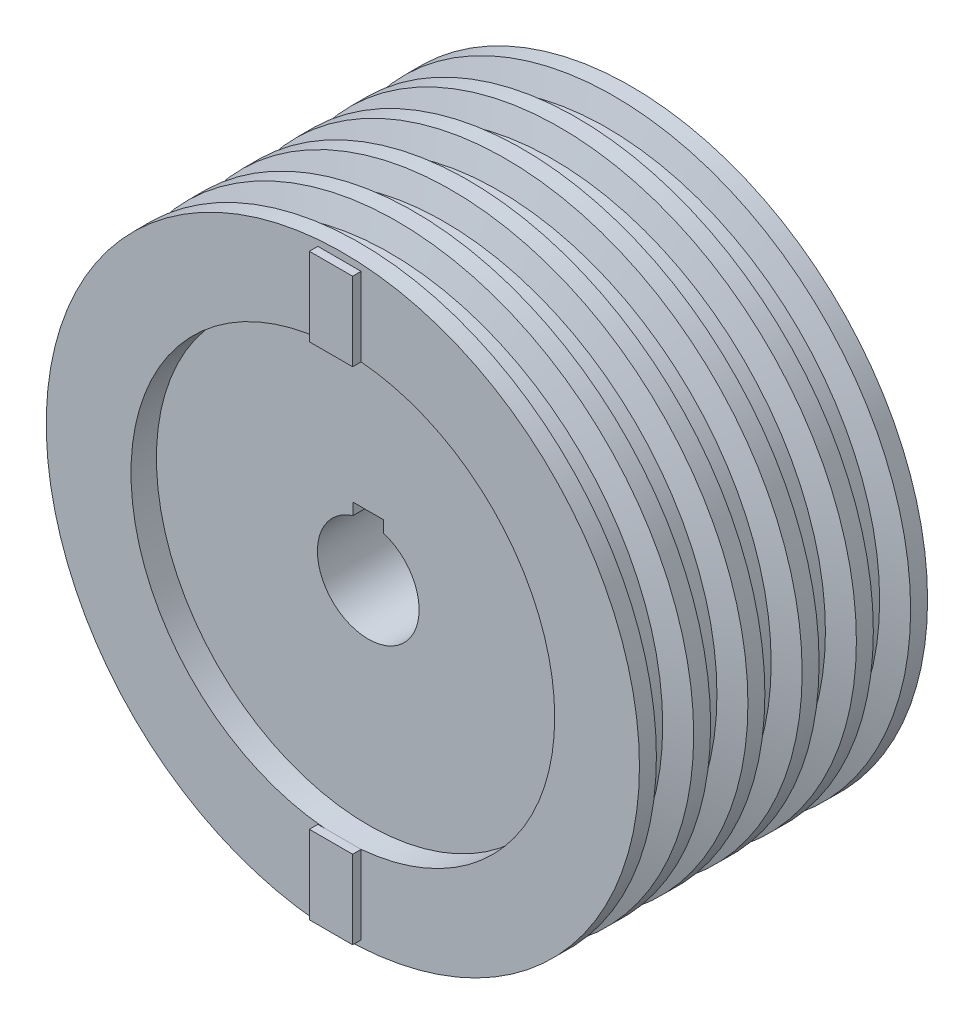
ISO-10303-21;
HEADER;
FILE_DESCRIPTION(('STEP AP214'),'2;1');
FILE_NAME('part.step','',(''),(''),'','','');
FILE_SCHEMA(('AUTOMOTIVE_DESIGN { 1 0 10303 214 1 1 1 1 }'));
ENDSEC;
DATA;
#1=APPLICATION_CONTEXT('core data for automotive mechanical design processes');
#2=APPLICATION_PROTOCOL_DEFINITION('international standard','automotive_design',2000,#1);
#3=PRODUCT_CONTEXT('',#1,'mechanical');
#4=PRODUCT('Part','Part','',(#3));
#5=PRODUCT_RELATED_PRODUCT_CATEGORY('part','',(#4));
#6=PRODUCT_DEFINITION_FORMATION('','',#4);
#7=PRODUCT_DEFINITION_CONTEXT('part definition',#1,'design');
#8=PRODUCT_DEFINITION('design','',#6,#7);
#9=PRODUCT_DEFINITION_SHAPE('','',#8);
#10=(LENGTH_UNIT() NAMED_UNIT(*) SI_UNIT(.MILLI.,.METRE.));
#11=(NAMED_UNIT(*) PLANE_ANGLE_UNIT() SI_UNIT($,.RADIAN.));
#12=(NAMED_UNIT(*) SI_UNIT($,.STERADIAN.) SOLID_ANGLE_UNIT());
#13=UNCERTAINTY_MEASURE_WITH_UNIT(LENGTH_MEASURE(1.E-05),#10,'distance_accuracy_value','');
#14=(GEOMETRIC_REPRESENTATION_CONTEXT(3) GLOBAL_UNCERTAINTY_ASSIGNED_CONTEXT((#13)) GLOBAL_UNIT_ASSIGNED_CONTEXT((#10,
#11,#12)) REPRESENTATION_CONTEXT('',''));
#15=CARTESIAN_POINT('',(0.,0.,0.));
#16=DIRECTION('',(0.,0.,1.));
#17=DIRECTION('',(1.,0.,0.));
#18=AXIS2_PLACEMENT_3D('',#15,#16,#17);
#19=CARTESIAN_POINT('',(0.,0.,85.));
#20=DIRECTION('',(0.,0.,-1.));
#21=DIRECTION('',(-1.,0.,0.));
#22=AXIS2_PLACEMENT_3D('',#19,#20,#21);
#23=CYLINDRICAL_SURFACE('',#22,175.);
#24=CARTESIAN_POINT('',(0.,0.,-75.));
#25=DIRECTION('',(0.,0.,1.));
#26=DIRECTION('',(1.,0.,0.));
#27=AXIS2_PLACEMENT_3D('',#24,#25,#26);
#28=CIRCLE('',#27,175.);
#29=CARTESIAN_POINT('',(175.,0.,-75.));
#30=VERTEX_POINT('',#29);
#31=EDGE_CURVE('E238',#30,#30,#28,.T.);
#32=ORIENTED_EDGE('',*,*,#31,.F.);
#33=EDGE_LOOP('',(#32));
#34=FACE_BOUND('',#33,.T.);
#35=CARTESIAN_POINT('',(0.,0.,-85.));
#36=DIRECTION('',(0.,0.,1.));
#37=DIRECTION('',(1.,0.,0.));
#38=AXIS2_PLACEMENT_3D('',#35,#36,#37);
#39=CIRCLE('',#38,175.);
#40=CARTESIAN_POINT('',(175.,0.,-85.));
#41=VERTEX_POINT('',#40);
#42=EDGE_CURVE('E346',#41,#41,#39,.T.);
#43=ORIENTED_EDGE('',*,*,#42,.T.);
#44=EDGE_LOOP('',(#43));
#45=FACE_BOUND('',#44,.T.);
#46=ADVANCED_FACE('F49',(#34,#45),#23,.T.);
#47=CARTESIAN_POINT('',(0.,0.,-85.));
#48=DIRECTION('',(0.,0.,1.));
#49=DIRECTION('',(1.,0.,0.));
#50=AXIS2_PLACEMENT_3D('',#47,#48,#49);
#51=CYLINDRICAL_SURFACE('',#50,30.);
#52=CARTESIAN_POINT('',(0.,0.,70.));
#53=DIRECTION('',(0.,0.,1.));
#54=DIRECTION('',(1.,0.,0.));
#55=AXIS2_PLACEMENT_3D('',#52,#53,#54);
#56=CIRCLE('',#55,30.);
#57=CARTESIAN_POINT('',(-9.,28.6181760425084,70.));
#58=VERTEX_POINT('',#57);
#59=CARTESIAN_POINT('',(9.,28.6181760425084,70.));
#60=VERTEX_POINT('',#59);
#61=EDGE_CURVE('E334',#58,#60,#56,.T.);
#62=ORIENTED_EDGE('',*,*,#61,.T.);
#63=DIRECTION('',(0.,0.,1.));
#64=VECTOR('',#63,1.);
#65=CARTESIAN_POINT('',(9.,28.6181760425084,-85.));
#66=LINE('',#65,#64);
#67=CARTESIAN_POINT('',(9.,28.6181760425084,-70.));
#68=VERTEX_POINT('',#67);
#69=EDGE_CURVE('E321',#60,#68,#66,.F.);
#70=ORIENTED_EDGE('',*,*,#69,.T.);
#71=CARTESIAN_POINT('',(0.,0.,-70.));
#72=DIRECTION('',(0.,0.,1.));
#73=DIRECTION('',(1.,0.,0.));
#74=AXIS2_PLACEMENT_3D('',#71,#72,#73);
#75=CIRCLE('',#74,30.);
#76=CARTESIAN_POINT('',(-9.,28.6181760425084,-70.));
#77=VERTEX_POINT('',#76);
#78=EDGE_CURVE('E325',#77,#68,#75,.T.);
#79=ORIENTED_EDGE('',*,*,#78,.F.);
#80=DIRECTION('',(0.,0.,1.));
#81=VECTOR('',#80,1.);
#82=CARTESIAN_POINT('',(-9.,28.6181760425084,-85.));
#83=LINE('',#82,#81);
#84=EDGE_CURVE('E314',#77,#58,#83,.T.);
#85=ORIENTED_EDGE('',*,*,#84,.T.);
#86=EDGE_LOOP('',(#62,#70,#79,#85));
#87=FACE_BOUND('',#86,.T.);
#88=ADVANCED_FACE('F375',(#87),#51,.F.);
#89=CARTESIAN_POINT('',(0.,0.,-85.));
#90=DIRECTION('',(0.,0.,1.));
#91=DIRECTION('',(1.,0.,0.));
#92=AXIS2_PLACEMENT_3D('',#89,#90,#91);
#93=PLANE('',#92);
#94=ORIENTED_EDGE('',*,*,#42,.F.);
#95=EDGE_LOOP('',(#94));
#96=FACE_BOUND('',#95,.T.);
#97=CARTESIAN_POINT('',(0.,0.,-85.));
#98=DIRECTION('',(0.,0.,1.));
#99=DIRECTION('',(1.,0.,0.));
#100=AXIS2_PLACEMENT_3D('',#97,#98,#99);
#101=CIRCLE('',#100,125.);
#102=CARTESIAN_POINT('',(125.,0.,-85.));
#103=VERTEX_POINT('',#102);
#104=EDGE_CURVE('E329',#103,#103,#101,.T.);
#105=ORIENTED_EDGE('',*,*,#104,.T.);
#106=EDGE_LOOP('',(#105));
#107=FACE_BOUND('',#106,.T.);
#108=ADVANCED_FACE('F463',(#96,#107),#93,.F.);
#109=CARTESIAN_POINT('',(0.,0.,75.));
#110=DIRECTION('',(0.,0.,1.));
#111=DIRECTION('',(1.,0.,0.));
#112=AXIS2_PLACEMENT_3D('',#109,#110,#111);
#113=CIRCLE('',#112,175.);
#114=CARTESIAN_POINT('',(175.,0.,75.));
#115=VERTEX_POINT('',#114);
#116=EDGE_CURVE('E171',#115,#115,#113,.T.);
#117=ORIENTED_EDGE('',*,*,#116,.T.);
#118=EDGE_LOOP('',(#117));
#119=FACE_BOUND('',#118,.T.);
#120=CARTESIAN_POINT('',(0.,0.,85.));
#121=DIRECTION('',(0.,0.,1.));
#122=DIRECTION('',(1.,0.,0.));
#123=AXIS2_PLACEMENT_3D('',#120,#121,#122);
#124=CIRCLE('',#123,175.);
#125=CARTESIAN_POINT('',(175.,0.,85.));
#126=VERTEX_POINT('',#125);
#127=EDGE_CURVE('E351',#126,#126,#124,.T.);
#128=ORIENTED_EDGE('',*,*,#127,.F.);
#129=EDGE_LOOP('',(#128));
#130=FACE_BOUND('',#129,.T.);
#131=ADVANCED_FACE('F51',(#119,#130),#23,.T.);
#132=CARTESIAN_POINT('',(0.,0.,85.));
#133=DIRECTION('',(0.,0.,1.));
#134=DIRECTION('',(1.,0.,0.));
#135=AXIS2_PLACEMENT_3D('',#132,#133,#134);
#136=PLANE('',#135);
#137=DIRECTION('',(0.,1.,0.));
#138=VECTOR('',#137,1.);
#139=CARTESIAN_POINT('',(10.7653534343434,170.810196385644,85.));
#140=LINE('',#139,#138);
#141=CARTESIAN_POINT('',(10.7653534343434,124.535565865473,85.));
#142=VERTEX_POINT('',#141);
#143=CARTESIAN_POINT('',(10.7653534343434,170.810196385644,85.));
#144=VERTEX_POINT('',#143);
#145=EDGE_CURVE('E413',#142,#144,#140,.T.);
#146=ORIENTED_EDGE('',*,*,#145,.F.);
#147=CARTESIAN_POINT('',(0.,0.,85.));
#148=DIRECTION('',(0.,0.,1.));
#149=DIRECTION('',(1.,0.,0.));
#150=AXIS2_PLACEMENT_3D('',#147,#148,#149);
#151=CIRCLE('',#150,125.);
#152=CARTESIAN_POINT('',(10.7653534343434,-124.535565865473,85.));
#153=VERTEX_POINT('',#152);
#154=EDGE_CURVE('E341',#153,#142,#151,.T.);
#155=ORIENTED_EDGE('',*,*,#154,.F.);
#156=DIRECTION('',(0.,1.,0.));
#157=VECTOR('',#156,1.);
#158=CARTESIAN_POINT('',(10.7653534343434,-170.810196385644,85.));
#159=LINE('',#158,#157);
#160=CARTESIAN_POINT('',(10.7653534343434,-170.810196385644,85.));
#161=VERTEX_POINT('',#160);
#162=EDGE_CURVE('E206',#161,#153,#159,.T.);
#163=ORIENTED_EDGE('',*,*,#162,.F.);
#164=DIRECTION('',(1.,0.,0.));
#165=VECTOR('',#164,1.);
#166=CARTESIAN_POINT('',(-14.7462040045161,-170.810196385644,85.));
#167=LINE('',#166,#165);
#168=CARTESIAN_POINT('',(-14.7462040045161,-170.810196385644,85.));
#169=VERTEX_POINT('',#168);
#170=EDGE_CURVE('E210',#169,#161,#167,.T.);
#171=ORIENTED_EDGE('',*,*,#170,.F.);
#172=DIRECTION('',(0.,-1.,0.));
#173=VECTOR('',#172,1.);
#174=CARTESIAN_POINT('',(-14.7462040045161,-170.810196385644,85.));
#175=LINE('',#174,#173);
#176=CARTESIAN_POINT('',(-14.7462040045161,-124.535565865473,85.));
#177=VERTEX_POINT('',#176);
#178=EDGE_CURVE('E199',#177,#169,#175,.T.);
#179=ORIENTED_EDGE('',*,*,#178,.F.);
#180=DIRECTION('',(-1.,0.,0.));
#181=VECTOR('',#180,1.);
#182=CARTESIAN_POINT('',(-14.7462040045161,-124.535565865473,85.));
#183=LINE('',#182,#181);
#184=CARTESIAN_POINT('',(-10.7653534343434,-124.535565865473,85.));
#185=VERTEX_POINT('',#184);
#186=EDGE_CURVE('E11',#185,#177,#183,.T.);
#187=ORIENTED_EDGE('',*,*,#186,.F.);
#188=CARTESIAN_POINT('',(-10.7653534343434,124.535565865473,85.));
#189=VERTEX_POINT('',#188);
#190=EDGE_CURVE('E350',#189,#185,#151,.T.);
#191=ORIENTED_EDGE('',*,*,#190,.F.);
#192=DIRECTION('',(1.,0.,0.));
#193=VECTOR('',#192,1.);
#194=CARTESIAN_POINT('',(-14.7462040045161,124.535565865473,85.));
#195=LINE('',#194,#193);
#196=CARTESIAN_POINT('',(-14.7462040045161,124.535565865473,85.));
#197=VERTEX_POINT('',#196);
#198=EDGE_CURVE('E405',#197,#189,#195,.T.);
#199=ORIENTED_EDGE('',*,*,#198,.F.);
#200=DIRECTION('',(0.,-1.,0.));
#201=VECTOR('',#200,1.);
#202=CARTESIAN_POINT('',(-14.7462040045161,170.810196385644,85.));
#203=LINE('',#202,#201);
#204=CARTESIAN_POINT('',(-14.7462040045161,170.810196385644,85.));
#205=VERTEX_POINT('',#204);
#206=EDGE_CURVE('E72',#205,#197,#203,.T.);
#207=ORIENTED_EDGE('',*,*,#206,.F.);
#208=DIRECTION('',(-1.,0.,0.));
#209=VECTOR('',#208,1.);
#210=CARTESIAN_POINT('',(-14.7462040045161,170.810196385644,85.));
#211=LINE('',#210,#209);
#212=EDGE_CURVE('E67',#144,#205,#211,.T.);
#213=ORIENTED_EDGE('',*,*,#212,.F.);
#214=EDGE_LOOP('',(#146,#155,#163,#171,#179,#187,#191,#199,#207,#213));
#215=FACE_BOUND('',#214,.T.);
#216=ORIENTED_EDGE('',*,*,#127,.T.);
#217=EDGE_LOOP('',(#216));
#218=FACE_BOUND('',#217,.T.);
#219=ADVANCED_FACE('F394',(#215,#218),#136,.T.);
#220=CARTESIAN_POINT('',(0.,0.,70.));
#221=DIRECTION('',(0.,0.,1.));
#222=DIRECTION('',(1.,0.,0.));
#223=AXIS2_PLACEMENT_3D('',#220,#221,#222);
#224=CYLINDRICAL_SURFACE('',#223,125.);
#225=CARTESIAN_POINT('',(0.,0.,70.));
#226=DIRECTION('',(0.,0.,1.));
#227=DIRECTION('',(1.,0.,0.));
#228=AXIS2_PLACEMENT_3D('',#225,#226,#227);
#229=CIRCLE('',#228,125.);
#230=CARTESIAN_POINT('',(125.,0.,70.));
#231=VERTEX_POINT('',#230);
#232=EDGE_CURVE('E342',#231,#231,#229,.T.);
#233=ORIENTED_EDGE('',*,*,#232,.F.);
#234=EDGE_LOOP('',(#233));
#235=FACE_BOUND('',#234,.T.);
#236=EDGE_CURVE('E347',#142,#189,#151,.T.);
#237=ORIENTED_EDGE('',*,*,#236,.T.);
#238=ORIENTED_EDGE('',*,*,#190,.T.);
#239=EDGE_CURVE('E407',#185,#153,#151,.T.);
#240=ORIENTED_EDGE('',*,*,#239,.T.);
#241=ORIENTED_EDGE('',*,*,#154,.T.);
#242=EDGE_LOOP('',(#237,#238,#240,#241));
#243=FACE_BOUND('',#242,.T.);
#244=ADVANCED_FACE('F388',(#235,#243),#224,.F.);
#245=CARTESIAN_POINT('',(0.,0.,70.));
#246=DIRECTION('',(0.,0.,1.));
#247=DIRECTION('',(1.,0.,0.));
#248=AXIS2_PLACEMENT_3D('',#245,#246,#247);
#249=PLANE('',#248);
#250=DIRECTION('',(0.,1.,0.));
#251=VECTOR('',#250,1.);
#252=CARTESIAN_POINT('',(9.,24.5,70.));
#253=LINE('',#252,#251);
#254=CARTESIAN_POINT('',(9.,35.5,70.));
#255=VERTEX_POINT('',#254);
#256=EDGE_CURVE('E242',#60,#255,#253,.T.);
#257=ORIENTED_EDGE('',*,*,#256,.F.);
#258=ORIENTED_EDGE('',*,*,#61,.F.);
#259=DIRECTION('',(0.,-1.,0.));
#260=VECTOR('',#259,1.);
#261=CARTESIAN_POINT('',(-9.,24.5,70.));
#262=LINE('',#261,#260);
#263=CARTESIAN_POINT('',(-9.,35.5,70.));
#264=VERTEX_POINT('',#263);
#265=EDGE_CURVE('E307',#264,#58,#262,.T.);
#266=ORIENTED_EDGE('',*,*,#265,.F.);
#267=DIRECTION('',(-1.,0.,0.));
#268=VECTOR('',#267,1.);
#269=CARTESIAN_POINT('',(-9.,35.5,70.));
#270=LINE('',#269,#268);
#271=EDGE_CURVE('E303',#255,#264,#270,.T.);
#272=ORIENTED_EDGE('',*,*,#271,.F.);
#273=EDGE_LOOP('',(#257,#258,#266,#272));
#274=FACE_BOUND('',#273,.T.);
#275=ORIENTED_EDGE('',*,*,#232,.T.);
#276=EDGE_LOOP('',(#275));
#277=FACE_BOUND('',#276,.T.);
#278=ADVANCED_FACE('F385',(#274,#277),#249,.T.);
#279=CARTESIAN_POINT('',(0.,0.,-70.));
#280=DIRECTION('',(0.,0.,-1.));
#281=DIRECTION('',(1.,0.,0.));
#282=AXIS2_PLACEMENT_3D('',#279,#280,#281);
#283=PLANE('',#282);
#284=DIRECTION('',(0.,-1.,0.));
#285=VECTOR('',#284,1.);
#286=CARTESIAN_POINT('',(9.,0.,-70.));
#287=LINE('',#286,#285);
#288=CARTESIAN_POINT('',(9.,35.5,-70.));
#289=VERTEX_POINT('',#288);
#290=EDGE_CURVE('E53',#289,#68,#287,.T.);
#291=ORIENTED_EDGE('',*,*,#290,.F.);
#292=DIRECTION('',(1.,0.,0.));
#293=VECTOR('',#292,1.);
#294=CARTESIAN_POINT('',(0.,35.5,-70.));
#295=LINE('',#294,#293);
#296=CARTESIAN_POINT('',(-9.,35.5,-70.));
#297=VERTEX_POINT('',#296);
#298=EDGE_CURVE('E355',#297,#289,#295,.T.);
#299=ORIENTED_EDGE('',*,*,#298,.F.);
#300=DIRECTION('',(0.,1.,0.));
#301=VECTOR('',#300,1.);
#302=CARTESIAN_POINT('',(-9.,0.,-70.));
#303=LINE('',#302,#301);
#304=EDGE_CURVE('E360',#77,#297,#303,.T.);
#305=ORIENTED_EDGE('',*,*,#304,.F.);
#306=ORIENTED_EDGE('',*,*,#78,.T.);
#307=EDGE_LOOP('',(#291,#299,#305,#306));
#308=FACE_BOUND('',#307,.T.);
#309=CARTESIAN_POINT('',(0.,0.,-70.));
#310=DIRECTION('',(0.,0.,1.));
#311=DIRECTION('',(1.,0.,0.));
#312=AXIS2_PLACEMENT_3D('',#309,#310,#311);
#313=CIRCLE('',#312,125.);
#314=CARTESIAN_POINT('',(125.,0.,-70.));
#315=VERTEX_POINT('',#314);
#316=EDGE_CURVE('E330',#315,#315,#313,.T.);
#317=ORIENTED_EDGE('',*,*,#316,.F.);
#318=EDGE_LOOP('',(#317));
#319=FACE_BOUND('',#318,.T.);
#320=ADVANCED_FACE('F377',(#308,#319),#283,.T.);
#321=CARTESIAN_POINT('',(0.,0.,-70.));
#322=DIRECTION('',(0.,0.,-1.));
#323=DIRECTION('',(-1.,0.,0.));
#324=AXIS2_PLACEMENT_3D('',#321,#322,#323);
#325=CYLINDRICAL_SURFACE('',#324,125.);
#326=ORIENTED_EDGE('',*,*,#316,.T.);
#327=EDGE_LOOP('',(#326));
#328=FACE_BOUND('',#327,.T.);
#329=ORIENTED_EDGE('',*,*,#104,.F.);
#330=EDGE_LOOP('',(#329));
#331=FACE_BOUND('',#330,.T.);
#332=ADVANCED_FACE('F564',(#328,#331),#325,.F.);
#333=CARTESIAN_POINT('',(9.,24.5,-85.));
#334=DIRECTION('',(1.,0.,0.));
#335=DIRECTION('',(0.,0.,-1.));
#336=AXIS2_PLACEMENT_3D('',#333,#334,#335);
#337=PLANE('',#336);
#338=ORIENTED_EDGE('',*,*,#256,.T.);
#339=DIRECTION('',(0.,0.,1.));
#340=VECTOR('',#339,1.);
#341=CARTESIAN_POINT('',(9.,35.5,-85.));
#342=LINE('',#341,#340);
#343=EDGE_CURVE('E310',#289,#255,#342,.T.);
#344=ORIENTED_EDGE('',*,*,#343,.F.);
#345=ORIENTED_EDGE('',*,*,#290,.T.);
#346=ORIENTED_EDGE('',*,*,#69,.F.);
#347=EDGE_LOOP('',(#338,#344,#345,#346));
#348=FACE_BOUND('',#347,.T.);
#349=ADVANCED_FACE('F370',(#348),#337,.F.);
#350=CARTESIAN_POINT('',(-9.,24.5,-85.));
#351=DIRECTION('',(-1.,0.,0.));
#352=DIRECTION('',(0.,0.,1.));
#353=AXIS2_PLACEMENT_3D('',#350,#351,#352);
#354=PLANE('',#353);
#355=ORIENTED_EDGE('',*,*,#304,.T.);
#356=DIRECTION('',(0.,0.,1.));
#357=VECTOR('',#356,1.);
#358=CARTESIAN_POINT('',(-9.,35.5,-85.));
#359=LINE('',#358,#357);
#360=EDGE_CURVE('E311',#297,#264,#359,.T.);
#361=ORIENTED_EDGE('',*,*,#360,.T.);
#362=ORIENTED_EDGE('',*,*,#265,.T.);
#363=ORIENTED_EDGE('',*,*,#84,.F.);
#364=EDGE_LOOP('',(#355,#361,#362,#363));
#365=FACE_BOUND('',#364,.T.);
#366=ADVANCED_FACE('F383',(#365),#354,.F.);
#367=CARTESIAN_POINT('',(-9.,35.5,-85.));
#368=DIRECTION('',(0.,1.,0.));
#369=DIRECTION('',(0.,0.,1.));
#370=AXIS2_PLACEMENT_3D('',#367,#368,#369);
#371=PLANE('',#370);
#372=ORIENTED_EDGE('',*,*,#298,.T.);
#373=ORIENTED_EDGE('',*,*,#343,.T.);
#374=ORIENTED_EDGE('',*,*,#271,.T.);
#375=ORIENTED_EDGE('',*,*,#360,.F.);
#376=EDGE_LOOP('',(#372,#373,#374,#375));
#377=FACE_BOUND('',#376,.T.);
#378=ADVANCED_FACE('F380',(#377),#371,.F.);
#379=CARTESIAN_POINT('',(0.,0.,53.));
#380=DIRECTION('',(0.,0.,-1.));
#381=DIRECTION('',(-1.,0.,0.));
#382=AXIS2_PLACEMENT_3D('',#379,#380,#381);
#383=CONICAL_SURFACE('',#382,175.,1.27409035395586);
#384=CARTESIAN_POINT('',(0.,0.,57.2802295404213));
#385=DIRECTION('',(0.,0.,1.));
#386=DIRECTION('',(1.,0.,0.));
#387=AXIS2_PLACEMENT_3D('',#384,#385,#386);
#388=CIRCLE('',#387,161.);
#389=CARTESIAN_POINT('',(161.,0.,57.2802295404213));
#390=VERTEX_POINT('',#389);
#391=EDGE_CURVE('E294',#390,#390,#388,.T.);
#392=ORIENTED_EDGE('',*,*,#391,.F.);
#393=EDGE_LOOP('',(#392));
#394=FACE_BOUND('',#393,.T.);
#395=CARTESIAN_POINT('',(0.,0.,53.));
#396=DIRECTION('',(0.,0.,1.));
#397=DIRECTION('',(1.,0.,0.));
#398=AXIS2_PLACEMENT_3D('',#395,#396,#397);
#399=CIRCLE('',#398,175.);
#400=CARTESIAN_POINT('',(175.,0.,53.));
#401=VERTEX_POINT('',#400);
#402=EDGE_CURVE('E280',#401,#401,#399,.T.);
#403=ORIENTED_EDGE('',*,*,#402,.T.);
#404=EDGE_LOOP('',(#403));
#405=FACE_BOUND('',#404,.T.);
#406=ADVANCED_FACE('F555',(#394,#405),#383,.T.);
#407=CARTESIAN_POINT('',(0.,0.,0.));
#408=DIRECTION('',(0.,0.,1.));
#409=DIRECTION('',(1.,0.,0.));
#410=AXIS2_PLACEMENT_3D('',#407,#408,#409);
#411=CYLINDRICAL_SURFACE('',#410,161.);
#412=CARTESIAN_POINT('',(0.,0.,70.7197704595789));
#413=DIRECTION('',(0.,0.,1.));
#414=DIRECTION('',(1.,0.,0.));
#415=AXIS2_PLACEMENT_3D('',#412,#413,#414);
#416=CIRCLE('',#415,161.);
#417=CARTESIAN_POINT('',(161.,0.,70.7197704595789));
#418=VERTEX_POINT('',#417);
#419=EDGE_CURVE('E176',#418,#418,#416,.T.);
#420=ORIENTED_EDGE('',*,*,#419,.F.);
#421=EDGE_LOOP('',(#420));
#422=FACE_BOUND('',#421,.T.);
#423=ORIENTED_EDGE('',*,*,#391,.T.);
#424=EDGE_LOOP('',(#423));
#425=FACE_BOUND('',#424,.T.);
#426=ADVANCED_FACE('F494',(#422,#425),#411,.T.);
#427=CARTESIAN_POINT('',(0.,0.,70.7197704595789));
#428=DIRECTION('',(0.,0.,1.));
#429=DIRECTION('',(1.,0.,0.));
#430=AXIS2_PLACEMENT_3D('',#427,#428,#429);
#431=CONICAL_SURFACE('',#430,161.,1.27409035395587);
#432=ORIENTED_EDGE('',*,*,#116,.F.);
#433=EDGE_LOOP('',(#432));
#434=FACE_BOUND('',#433,.T.);
#435=ORIENTED_EDGE('',*,*,#419,.T.);
#436=EDGE_LOOP('',(#435));
#437=FACE_BOUND('',#436,.T.);
#438=ADVANCED_FACE('F484',(#434,#437),#431,.T.);
#439=CARTESIAN_POINT('',(0.,0.,43.));
#440=DIRECTION('',(0.,0.,1.));
#441=DIRECTION('',(1.,0.,0.));
#442=AXIS2_PLACEMENT_3D('',#439,#440,#441);
#443=CIRCLE('',#442,175.);
#444=CARTESIAN_POINT('',(175.,0.,43.));
#445=VERTEX_POINT('',#444);
#446=EDGE_CURVE('E284',#445,#445,#443,.T.);
#447=ORIENTED_EDGE('',*,*,#446,.T.);
#448=EDGE_LOOP('',(#447));
#449=FACE_BOUND('',#448,.T.);
#450=ORIENTED_EDGE('',*,*,#402,.F.);
#451=EDGE_LOOP('',(#450));
#452=FACE_BOUND('',#451,.T.);
#453=ADVANCED_FACE('F473',(#449,#452),#23,.T.);
#454=CARTESIAN_POINT('',(0.,0.,21.));
#455=DIRECTION('',(0.,0.,-1.));
#456=DIRECTION('',(-1.,0.,0.));
#457=AXIS2_PLACEMENT_3D('',#454,#455,#456);
#458=CONICAL_SURFACE('',#457,175.,1.27409035395587);
#459=CARTESIAN_POINT('',(0.,0.,25.2802295404211));
#460=DIRECTION('',(0.,0.,1.));
#461=DIRECTION('',(1.,0.,0.));
#462=AXIS2_PLACEMENT_3D('',#459,#460,#461);
#463=CIRCLE('',#462,161.);
#464=CARTESIAN_POINT('',(161.,0.,25.2802295404211));
#465=VERTEX_POINT('',#464);
#466=EDGE_CURVE('E275',#465,#465,#463,.T.);
#467=ORIENTED_EDGE('',*,*,#466,.F.);
#468=EDGE_LOOP('',(#467));
#469=FACE_BOUND('',#468,.T.);
#470=CARTESIAN_POINT('',(0.,0.,21.));
#471=DIRECTION('',(0.,0.,1.));
#472=DIRECTION('',(1.,0.,0.));
#473=AXIS2_PLACEMENT_3D('',#470,#471,#472);
#474=CIRCLE('',#473,175.);
#475=CARTESIAN_POINT('',(175.,0.,21.));
#476=VERTEX_POINT('',#475);
#477=EDGE_CURVE('E264',#476,#476,#474,.T.);
#478=ORIENTED_EDGE('',*,*,#477,.T.);
#479=EDGE_LOOP('',(#478));
#480=FACE_BOUND('',#479,.T.);
#481=ADVANCED_FACE('F483',(#469,#480),#458,.T.);
#482=CARTESIAN_POINT('',(0.,0.,38.7197704595787));
#483=DIRECTION('',(0.,0.,1.));
#484=DIRECTION('',(1.,0.,0.));
#485=AXIS2_PLACEMENT_3D('',#482,#483,#484);
#486=CONICAL_SURFACE('',#485,161.,1.27409035395586);
#487=ORIENTED_EDGE('',*,*,#446,.F.);
#488=EDGE_LOOP('',(#487));
#489=FACE_BOUND('',#488,.T.);
#490=CARTESIAN_POINT('',(0.,0.,38.7197704595787));
#491=DIRECTION('',(0.,0.,1.));
#492=DIRECTION('',(1.,0.,0.));
#493=AXIS2_PLACEMENT_3D('',#490,#491,#492);
#494=CIRCLE('',#493,161.);
#495=CARTESIAN_POINT('',(161.,0.,38.7197704595787));
#496=VERTEX_POINT('',#495);
#497=EDGE_CURVE('E279',#496,#496,#494,.T.);
#498=ORIENTED_EDGE('',*,*,#497,.T.);
#499=EDGE_LOOP('',(#498));
#500=FACE_BOUND('',#499,.T.);
#501=ADVANCED_FACE('F491',(#489,#500),#486,.T.);
#502=CARTESIAN_POINT('',(0.,0.,0.));
#503=DIRECTION('',(0.,0.,1.));
#504=DIRECTION('',(1.,0.,0.));
#505=AXIS2_PLACEMENT_3D('',#502,#503,#504);
#506=CYLINDRICAL_SURFACE('',#505,161.);
#507=ORIENTED_EDGE('',*,*,#497,.F.);
#508=EDGE_LOOP('',(#507));
#509=FACE_BOUND('',#508,.T.);
#510=ORIENTED_EDGE('',*,*,#466,.T.);
#511=EDGE_LOOP('',(#510));
#512=FACE_BOUND('',#511,.T.);
#513=ADVANCED_FACE('F500',(#509,#512),#506,.T.);
#514=CARTESIAN_POINT('',(0.,0.,11.));
#515=DIRECTION('',(0.,0.,1.));
#516=DIRECTION('',(1.,0.,0.));
#517=AXIS2_PLACEMENT_3D('',#514,#515,#516);
#518=CIRCLE('',#517,175.);
#519=CARTESIAN_POINT('',(175.,0.,11.));
#520=VERTEX_POINT('',#519);
#521=EDGE_CURVE('E259',#520,#520,#518,.T.);
#522=ORIENTED_EDGE('',*,*,#521,.T.);
#523=EDGE_LOOP('',(#522));
#524=FACE_BOUND('',#523,.T.);
#525=ORIENTED_EDGE('',*,*,#477,.F.);
#526=EDGE_LOOP('',(#525));
#527=FACE_BOUND('',#526,.T.);
#528=ADVANCED_FACE('F486',(#524,#527),#23,.T.);
#529=CARTESIAN_POINT('',(0.,0.,-11.));
#530=DIRECTION('',(0.,0.,-1.));
#531=DIRECTION('',(-1.,0.,0.));
#532=AXIS2_PLACEMENT_3D('',#529,#530,#531);
#533=CONICAL_SURFACE('',#532,175.,1.27409035395586);
#534=CARTESIAN_POINT('',(0.,0.,-6.7197704595787));
#535=DIRECTION('',(0.,0.,1.));
#536=DIRECTION('',(1.,0.,0.));
#537=AXIS2_PLACEMENT_3D('',#534,#535,#536);
#538=CIRCLE('',#537,161.);
#539=CARTESIAN_POINT('',(161.,0.,-6.7197704595787));
#540=VERTEX_POINT('',#539);
#541=EDGE_CURVE('E268',#540,#540,#538,.T.);
#542=ORIENTED_EDGE('',*,*,#541,.F.);
#543=EDGE_LOOP('',(#542));
#544=FACE_BOUND('',#543,.T.);
#545=CARTESIAN_POINT('',(0.,0.,-11.));
#546=DIRECTION('',(0.,0.,1.));
#547=DIRECTION('',(1.,0.,0.));
#548=AXIS2_PLACEMENT_3D('',#545,#546,#547);
#549=CIRCLE('',#548,175.);
#550=CARTESIAN_POINT('',(175.,0.,-11.));
#551=VERTEX_POINT('',#550);
#552=EDGE_CURVE('E248',#551,#551,#549,.T.);
#553=ORIENTED_EDGE('',*,*,#552,.T.);
#554=EDGE_LOOP('',(#553));
#555=FACE_BOUND('',#554,.T.);
#556=ADVANCED_FACE('F499',(#544,#555),#533,.T.);
#557=CARTESIAN_POINT('',(0.,0.,0.));
#558=DIRECTION('',(0.,0.,1.));
#559=DIRECTION('',(1.,0.,0.));
#560=AXIS2_PLACEMENT_3D('',#557,#558,#559);
#561=CYLINDRICAL_SURFACE('',#560,161.);
#562=CARTESIAN_POINT('',(0.,0.,6.71977045957892));
#563=DIRECTION('',(0.,0.,1.));
#564=DIRECTION('',(1.,0.,0.));
#565=AXIS2_PLACEMENT_3D('',#562,#563,#564);
#566=CIRCLE('',#565,161.);
#567=CARTESIAN_POINT('',(161.,0.,6.71977045957892));
#568=VERTEX_POINT('',#567);
#569=EDGE_CURVE('E263',#568,#568,#566,.T.);
#570=ORIENTED_EDGE('',*,*,#569,.F.);
#571=EDGE_LOOP('',(#570));
#572=FACE_BOUND('',#571,.T.);
#573=ORIENTED_EDGE('',*,*,#541,.T.);
#574=EDGE_LOOP('',(#573));
#575=FACE_BOUND('',#574,.T.);
#576=ADVANCED_FACE('F506',(#572,#575),#561,.T.);
#577=CARTESIAN_POINT('',(0.,0.,6.71977045957892));
#578=DIRECTION('',(0.,0.,1.));
#579=DIRECTION('',(1.,0.,0.));
#580=AXIS2_PLACEMENT_3D('',#577,#578,#579);
#581=CONICAL_SURFACE('',#580,161.,1.27409035395587);
#582=ORIENTED_EDGE('',*,*,#521,.F.);
#583=EDGE_LOOP('',(#582));
#584=FACE_BOUND('',#583,.T.);
#585=ORIENTED_EDGE('',*,*,#569,.T.);
#586=EDGE_LOOP('',(#585));
#587=FACE_BOUND('',#586,.T.);
#588=ADVANCED_FACE('F514',(#584,#587),#581,.T.);
#589=CARTESIAN_POINT('',(0.,0.,-21.));
#590=DIRECTION('',(0.,0.,1.));
#591=DIRECTION('',(1.,0.,0.));
#592=AXIS2_PLACEMENT_3D('',#589,#590,#591);
#593=CIRCLE('',#592,175.);
#594=CARTESIAN_POINT('',(175.,0.,-21.));
#595=VERTEX_POINT('',#594);
#596=EDGE_CURVE('E252',#595,#595,#593,.T.);
#597=ORIENTED_EDGE('',*,*,#596,.T.);
#598=EDGE_LOOP('',(#597));
#599=FACE_BOUND('',#598,.T.);
#600=ORIENTED_EDGE('',*,*,#552,.F.);
#601=EDGE_LOOP('',(#600));
#602=FACE_BOUND('',#601,.T.);
#603=ADVANCED_FACE('F471',(#599,#602),#23,.T.);
#604=CARTESIAN_POINT('',(0.,0.,-43.));
#605=DIRECTION('',(0.,0.,-1.));
#606=DIRECTION('',(-1.,0.,0.));
#607=AXIS2_PLACEMENT_3D('',#604,#605,#606);
#608=CONICAL_SURFACE('',#607,175.,1.27409035395587);
#609=CARTESIAN_POINT('',(0.,0.,-38.719770459579));
#610=DIRECTION('',(0.,0.,1.));
#611=DIRECTION('',(1.,0.,0.));
#612=AXIS2_PLACEMENT_3D('',#609,#610,#611);
#613=CIRCLE('',#612,161.);
#614=CARTESIAN_POINT('',(161.,0.,-38.719770459579));
#615=VERTEX_POINT('',#614);
#616=EDGE_CURVE('E243',#615,#615,#613,.T.);
#617=ORIENTED_EDGE('',*,*,#616,.F.);
#618=EDGE_LOOP('',(#617));
#619=FACE_BOUND('',#618,.T.);
#620=CARTESIAN_POINT('',(0.,0.,-43.));
#621=DIRECTION('',(0.,0.,1.));
#622=DIRECTION('',(1.,0.,0.));
#623=AXIS2_PLACEMENT_3D('',#620,#621,#622);
#624=CIRCLE('',#623,175.);
#625=CARTESIAN_POINT('',(175.,0.,-43.));
#626=VERTEX_POINT('',#625);
#627=EDGE_CURVE('E230',#626,#626,#624,.T.);
#628=ORIENTED_EDGE('',*,*,#627,.T.);
#629=EDGE_LOOP('',(#628));
#630=FACE_BOUND('',#629,.T.);
#631=ADVANCED_FACE('F513',(#619,#630),#608,.T.);
#632=CARTESIAN_POINT('',(0.,0.,-25.2802295404213));
#633=DIRECTION('',(0.,0.,1.));
#634=DIRECTION('',(1.,0.,0.));
#635=AXIS2_PLACEMENT_3D('',#632,#633,#634);
#636=CONICAL_SURFACE('',#635,161.,1.27409035395586);
#637=ORIENTED_EDGE('',*,*,#596,.F.);
#638=EDGE_LOOP('',(#637));
#639=FACE_BOUND('',#638,.T.);
#640=CARTESIAN_POINT('',(0.,0.,-25.2802295404213));
#641=DIRECTION('',(0.,0.,1.));
#642=DIRECTION('',(1.,0.,0.));
#643=AXIS2_PLACEMENT_3D('',#640,#641,#642);
#644=CIRCLE('',#643,161.);
#645=CARTESIAN_POINT('',(161.,0.,-25.2802295404213));
#646=VERTEX_POINT('',#645);
#647=EDGE_CURVE('E247',#646,#646,#644,.T.);
#648=ORIENTED_EDGE('',*,*,#647,.T.);
#649=EDGE_LOOP('',(#648));
#650=FACE_BOUND('',#649,.T.);
#651=ADVANCED_FACE('F520',(#639,#650),#636,.T.);
#652=CARTESIAN_POINT('',(0.,0.,0.));
#653=DIRECTION('',(0.,0.,1.));
#654=DIRECTION('',(1.,0.,0.));
#655=AXIS2_PLACEMENT_3D('',#652,#653,#654);
#656=CYLINDRICAL_SURFACE('',#655,161.);
#657=ORIENTED_EDGE('',*,*,#647,.F.);
#658=EDGE_LOOP('',(#657));
#659=FACE_BOUND('',#658,.T.);
#660=ORIENTED_EDGE('',*,*,#616,.T.);
#661=EDGE_LOOP('',(#660));
#662=FACE_BOUND('',#661,.T.);
#663=ADVANCED_FACE('F469',(#659,#662),#656,.T.);
#664=CARTESIAN_POINT('',(0.,0.,-53.));
#665=DIRECTION('',(0.,0.,1.));
#666=DIRECTION('',(1.,0.,0.));
#667=AXIS2_PLACEMENT_3D('',#664,#665,#666);
#668=CIRCLE('',#667,175.);
#669=CARTESIAN_POINT('',(175.,0.,-53.));
#670=VERTEX_POINT('',#669);
#671=EDGE_CURVE('E225',#670,#670,#668,.T.);
#672=ORIENTED_EDGE('',*,*,#671,.T.);
#673=EDGE_LOOP('',(#672));
#674=FACE_BOUND('',#673,.T.);
#675=ORIENTED_EDGE('',*,*,#627,.F.);
#676=EDGE_LOOP('',(#675));
#677=FACE_BOUND('',#676,.T.);
#678=ADVANCED_FACE('F457',(#674,#677),#23,.T.);
#679=CARTESIAN_POINT('',(0.,0.,-75.));
#680=DIRECTION('',(0.,0.,-1.));
#681=DIRECTION('',(-1.,0.,0.));
#682=AXIS2_PLACEMENT_3D('',#679,#680,#681);
#683=CONICAL_SURFACE('',#682,175.,1.27409035395586);
#684=CARTESIAN_POINT('',(0.,0.,-70.7197704595787));
#685=DIRECTION('',(0.,0.,1.));
#686=DIRECTION('',(1.,0.,0.));
#687=AXIS2_PLACEMENT_3D('',#684,#685,#686);
#688=CIRCLE('',#687,161.);
#689=CARTESIAN_POINT('',(161.,0.,-70.7197704595787));
#690=VERTEX_POINT('',#689);
#691=EDGE_CURVE('E234',#690,#690,#688,.T.);
#692=ORIENTED_EDGE('',*,*,#691,.F.);
#693=EDGE_LOOP('',(#692));
#694=FACE_BOUND('',#693,.T.);
#695=ORIENTED_EDGE('',*,*,#31,.T.);
#696=EDGE_LOOP('',(#695));
#697=FACE_BOUND('',#696,.T.);
#698=ADVANCED_FACE('F468',(#694,#697),#683,.T.);
#699=CARTESIAN_POINT('',(0.,0.,0.));
#700=DIRECTION('',(0.,0.,1.));
#701=DIRECTION('',(1.,0.,0.));
#702=AXIS2_PLACEMENT_3D('',#699,#700,#701);
#703=CYLINDRICAL_SURFACE('',#702,161.);
#704=CARTESIAN_POINT('',(0.,0.,-57.2802295404211));
#705=DIRECTION('',(0.,0.,1.));
#706=DIRECTION('',(1.,0.,0.));
#707=AXIS2_PLACEMENT_3D('',#704,#705,#706);
#708=CIRCLE('',#707,161.);
#709=CARTESIAN_POINT('',(161.,0.,-57.2802295404211));
#710=VERTEX_POINT('',#709);
#711=EDGE_CURVE('E229',#710,#710,#708,.T.);
#712=ORIENTED_EDGE('',*,*,#711,.F.);
#713=EDGE_LOOP('',(#712));
#714=FACE_BOUND('',#713,.T.);
#715=ORIENTED_EDGE('',*,*,#691,.T.);
#716=EDGE_LOOP('',(#715));
#717=FACE_BOUND('',#716,.T.);
#718=ADVANCED_FACE('F711',(#714,#717),#703,.T.);
#719=CARTESIAN_POINT('',(0.,0.,-57.2802295404211));
#720=DIRECTION('',(0.,0.,1.));
#721=DIRECTION('',(1.,0.,0.));
#722=AXIS2_PLACEMENT_3D('',#719,#720,#721);
#723=CONICAL_SURFACE('',#722,161.,1.27409035395587);
#724=ORIENTED_EDGE('',*,*,#671,.F.);
#725=EDGE_LOOP('',(#724));
#726=FACE_BOUND('',#725,.T.);
#727=ORIENTED_EDGE('',*,*,#711,.T.);
#728=EDGE_LOOP('',(#727));
#729=FACE_BOUND('',#728,.T.);
#730=ADVANCED_FACE('F720',(#726,#729),#723,.T.);
#731=CARTESIAN_POINT('',(-14.7462040045161,-170.810196385644,90.));
#732=DIRECTION('',(0.,1.,0.));
#733=DIRECTION('',(0.,0.,1.));
#734=AXIS2_PLACEMENT_3D('',#731,#732,#733);
#735=PLANE('',#734);
#736=ORIENTED_EDGE('',*,*,#170,.T.);
#737=DIRECTION('',(0.,0.,-1.));
#738=VECTOR('',#737,1.);
#739=CARTESIAN_POINT('',(10.7653534343434,-170.810196385644,90.));
#740=LINE('',#739,#738);
#741=CARTESIAN_POINT('',(10.7653534343434,-170.810196385644,90.));
#742=VERTEX_POINT('',#741);
#743=EDGE_CURVE('E182',#742,#161,#740,.T.);
#744=ORIENTED_EDGE('',*,*,#743,.F.);
#745=DIRECTION('',(1.,0.,0.));
#746=VECTOR('',#745,1.);
#747=CARTESIAN_POINT('',(-14.7462040045161,-170.810196385644,90.));
#748=LINE('',#747,#746);
#749=CARTESIAN_POINT('',(-14.7462040045161,-170.810196385644,90.));
#750=VERTEX_POINT('',#749);
#751=EDGE_CURVE('E202',#750,#742,#748,.T.);
#752=ORIENTED_EDGE('',*,*,#751,.F.);
#753=DIRECTION('',(0.,0.,-1.));
#754=VECTOR('',#753,1.);
#755=CARTESIAN_POINT('',(-14.7462040045161,-170.810196385644,90.));
#756=LINE('',#755,#754);
#757=EDGE_CURVE('E194',#750,#169,#756,.T.);
#758=ORIENTED_EDGE('',*,*,#757,.T.);
#759=EDGE_LOOP('',(#736,#744,#752,#758));
#760=FACE_BOUND('',#759,.T.);
#761=ADVANCED_FACE('F729',(#760),#735,.F.);
#762=CARTESIAN_POINT('',(10.7653534343434,-170.810196385644,90.));
#763=DIRECTION('',(-1.,0.,0.));
#764=DIRECTION('',(0.,0.,1.));
#765=AXIS2_PLACEMENT_3D('',#762,#763,#764);
#766=PLANE('',#765);
#767=ORIENTED_EDGE('',*,*,#162,.T.);
#768=DIRECTION('',(0.,0.,-1.));
#769=VECTOR('',#768,1.);
#770=CARTESIAN_POINT('',(10.7653534343434,-124.535565865473,90.));
#771=LINE('',#770,#769);
#772=CARTESIAN_POINT('',(10.7653534343434,-124.535565865473,90.));
#773=VERTEX_POINT('',#772);
#774=EDGE_CURVE('E186',#773,#153,#771,.T.);
#775=ORIENTED_EDGE('',*,*,#774,.F.);
#776=DIRECTION('',(0.,1.,0.));
#777=VECTOR('',#776,1.);
#778=CARTESIAN_POINT('',(10.7653534343434,-170.810196385644,90.));
#779=LINE('',#778,#777);
#780=EDGE_CURVE('E219',#742,#773,#779,.T.);
#781=ORIENTED_EDGE('',*,*,#780,.F.);
#782=ORIENTED_EDGE('',*,*,#743,.T.);
#783=EDGE_LOOP('',(#767,#775,#781,#782));
#784=FACE_BOUND('',#783,.T.);
#785=ADVANCED_FACE('F433',(#784),#766,.F.);
#786=CARTESIAN_POINT('',(-14.7462040045161,-124.535565865473,90.));
#787=DIRECTION('',(0.,-1.,0.));
#788=DIRECTION('',(0.,0.,-1.));
#789=AXIS2_PLACEMENT_3D('',#786,#787,#788);
#790=PLANE('',#789);
#791=EDGE_CURVE('E60',#153,#185,#183,.T.);
#792=ORIENTED_EDGE('',*,*,#791,.T.);
#793=ORIENTED_EDGE('',*,*,#186,.T.);
#794=DIRECTION('',(0.,0.,-1.));
#795=VECTOR('',#794,1.);
#796=CARTESIAN_POINT('',(-14.7462040045161,-124.535565865473,90.));
#797=LINE('',#796,#795);
#798=CARTESIAN_POINT('',(-14.7462040045161,-124.535565865473,90.));
#799=VERTEX_POINT('',#798);
#800=EDGE_CURVE('E190',#799,#177,#797,.T.);
#801=ORIENTED_EDGE('',*,*,#800,.F.);
#802=DIRECTION('',(-1.,0.,0.));
#803=VECTOR('',#802,1.);
#804=CARTESIAN_POINT('',(-14.7462040045161,-124.535565865473,90.));
#805=LINE('',#804,#803);
#806=EDGE_CURVE('E216',#773,#799,#805,.T.);
#807=ORIENTED_EDGE('',*,*,#806,.F.);
#808=ORIENTED_EDGE('',*,*,#774,.T.);
#809=EDGE_LOOP('',(#792,#793,#801,#807,#808));
#810=FACE_BOUND('',#809,.T.);
#811=ADVANCED_FACE('F438',(#810),#790,.F.);
#812=CARTESIAN_POINT('',(-14.7462040045161,-170.810196385644,90.));
#813=DIRECTION('',(1.,0.,0.));
#814=DIRECTION('',(0.,0.,-1.));
#815=AXIS2_PLACEMENT_3D('',#812,#813,#814);
#816=PLANE('',#815);
#817=ORIENTED_EDGE('',*,*,#178,.T.);
#818=ORIENTED_EDGE('',*,*,#757,.F.);
#819=DIRECTION('',(0.,-1.,0.));
#820=VECTOR('',#819,1.);
#821=CARTESIAN_POINT('',(-14.7462040045161,-170.810196385644,90.));
#822=LINE('',#821,#820);
#823=EDGE_CURVE('E198',#799,#750,#822,.T.);
#824=ORIENTED_EDGE('',*,*,#823,.F.);
#825=ORIENTED_EDGE('',*,*,#800,.T.);
#826=EDGE_LOOP('',(#817,#818,#824,#825));
#827=FACE_BOUND('',#826,.T.);
#828=ADVANCED_FACE('F451',(#827),#816,.F.);
#829=CARTESIAN_POINT('',(0.,0.,90.));
#830=DIRECTION('',(0.,0.,1.));
#831=DIRECTION('',(1.,0.,0.));
#832=AXIS2_PLACEMENT_3D('',#829,#830,#831);
#833=PLANE('',#832);
#834=ORIENTED_EDGE('',*,*,#751,.T.);
#835=ORIENTED_EDGE('',*,*,#780,.T.);
#836=ORIENTED_EDGE('',*,*,#806,.T.);
#837=ORIENTED_EDGE('',*,*,#823,.T.);
#838=EDGE_LOOP('',(#834,#835,#836,#837));
#839=FACE_BOUND('',#838,.T.);
#840=ADVANCED_FACE('F444',(#839),#833,.T.);
#841=CARTESIAN_POINT('',(0.,0.,85.));
#842=DIRECTION('',(0.,0.,1.));
#843=DIRECTION('',(1.,0.,0.));
#844=AXIS2_PLACEMENT_3D('',#841,#842,#843);
#845=PLANE('',#844);
#846=ORIENTED_EDGE('',*,*,#239,.F.);
#847=ORIENTED_EDGE('',*,*,#791,.F.);
#848=EDGE_LOOP('',(#846,#847));
#849=FACE_BOUND('',#848,.T.);
#850=ADVANCED_FACE('F441',(#849),#845,.F.);
#851=CARTESIAN_POINT('',(-14.7462040045161,170.810196385644,90.));
#852=DIRECTION('',(1.,0.,0.));
#853=DIRECTION('',(0.,0.,-1.));
#854=AXIS2_PLACEMENT_3D('',#851,#852,#853);
#855=PLANE('',#854);
#856=ORIENTED_EDGE('',*,*,#206,.T.);
#857=DIRECTION('',(0.,0.,-1.));
#858=VECTOR('',#857,1.);
#859=CARTESIAN_POINT('',(-14.7462040045161,124.535565865473,90.));
#860=LINE('',#859,#858);
#861=CARTESIAN_POINT('',(-14.7462040045161,124.535565865473,90.));
#862=VERTEX_POINT('',#861);
#863=EDGE_CURVE('E150',#862,#197,#860,.T.);
#864=ORIENTED_EDGE('',*,*,#863,.F.);
#865=DIRECTION('',(0.,-1.,0.));
#866=VECTOR('',#865,1.);
#867=CARTESIAN_POINT('',(-14.7462040045161,170.810196385644,90.));
#868=LINE('',#867,#866);
#869=CARTESIAN_POINT('',(-14.7462040045161,170.810196385644,90.));
#870=VERTEX_POINT('',#869);
#871=EDGE_CURVE('E158',#870,#862,#868,.T.);
#872=ORIENTED_EDGE('',*,*,#871,.F.);
#873=DIRECTION('',(0.,0.,-1.));
#874=VECTOR('',#873,1.);
#875=CARTESIAN_POINT('',(-14.7462040045161,170.810196385644,90.));
#876=LINE('',#875,#874);
#877=EDGE_CURVE('E421',#870,#205,#876,.T.);
#878=ORIENTED_EDGE('',*,*,#877,.T.);
#879=EDGE_LOOP('',(#856,#864,#872,#878));
#880=FACE_BOUND('',#879,.T.);
#881=ADVANCED_FACE('F169',(#880),#855,.F.);
#882=CARTESIAN_POINT('',(-14.7462040045161,124.535565865473,90.));
#883=DIRECTION('',(0.,1.,0.));
#884=DIRECTION('',(0.,0.,1.));
#885=AXIS2_PLACEMENT_3D('',#882,#883,#884);
#886=PLANE('',#885);
#887=ORIENTED_EDGE('',*,*,#198,.T.);
#888=EDGE_CURVE('E408',#189,#142,#195,.T.);
#889=ORIENTED_EDGE('',*,*,#888,.T.);
#890=DIRECTION('',(0.,0.,-1.));
#891=VECTOR('',#890,1.);
#892=CARTESIAN_POINT('',(10.7653534343434,124.535565865473,90.));
#893=LINE('',#892,#891);
#894=CARTESIAN_POINT('',(10.7653534343434,124.535565865473,90.));
#895=VERTEX_POINT('',#894);
#896=EDGE_CURVE('E153',#895,#142,#893,.T.);
#897=ORIENTED_EDGE('',*,*,#896,.F.);
#898=DIRECTION('',(1.,0.,0.));
#899=VECTOR('',#898,1.);
#900=CARTESIAN_POINT('',(-14.7462040045161,124.535565865473,90.));
#901=LINE('',#900,#899);
#902=EDGE_CURVE('E145',#862,#895,#901,.T.);
#903=ORIENTED_EDGE('',*,*,#902,.F.);
#904=ORIENTED_EDGE('',*,*,#863,.T.);
#905=EDGE_LOOP('',(#887,#889,#897,#903,#904));
#906=FACE_BOUND('',#905,.T.);
#907=ADVANCED_FACE('F148',(#906),#886,.F.);
#908=CARTESIAN_POINT('',(10.7653534343434,170.810196385644,90.));
#909=DIRECTION('',(-1.,0.,0.));
#910=DIRECTION('',(0.,0.,1.));
#911=AXIS2_PLACEMENT_3D('',#908,#909,#910);
#912=PLANE('',#911);
#913=ORIENTED_EDGE('',*,*,#145,.T.);
#914=DIRECTION('',(0.,0.,-1.));
#915=VECTOR('',#914,1.);
#916=CARTESIAN_POINT('',(10.7653534343434,170.810196385644,90.));
#917=LINE('',#916,#915);
#918=CARTESIAN_POINT('',(10.7653534343434,170.810196385644,90.));
#919=VERTEX_POINT('',#918);
#920=EDGE_CURVE('E178',#919,#144,#917,.T.);
#921=ORIENTED_EDGE('',*,*,#920,.F.);
#922=DIRECTION('',(0.,1.,0.));
#923=VECTOR('',#922,1.);
#924=CARTESIAN_POINT('',(10.7653534343434,170.810196385644,90.));
#925=LINE('',#924,#923);
#926=EDGE_CURVE('E157',#895,#919,#925,.T.);
#927=ORIENTED_EDGE('',*,*,#926,.F.);
#928=ORIENTED_EDGE('',*,*,#896,.T.);
#929=EDGE_LOOP('',(#913,#921,#927,#928));
#930=FACE_BOUND('',#929,.T.);
#931=ADVANCED_FACE('F429',(#930),#912,.F.);
#932=CARTESIAN_POINT('',(-14.7462040045161,170.810196385644,90.));
#933=DIRECTION('',(0.,-1.,0.));
#934=DIRECTION('',(0.,0.,-1.));
#935=AXIS2_PLACEMENT_3D('',#932,#933,#934);
#936=PLANE('',#935);
#937=ORIENTED_EDGE('',*,*,#212,.T.);
#938=ORIENTED_EDGE('',*,*,#877,.F.);
#939=DIRECTION('',(-1.,0.,0.));
#940=VECTOR('',#939,1.);
#941=CARTESIAN_POINT('',(-14.7462040045161,170.810196385644,90.));
#942=LINE('',#941,#940);
#943=EDGE_CURVE('E163',#919,#870,#942,.T.);
#944=ORIENTED_EDGE('',*,*,#943,.F.);
#945=ORIENTED_EDGE('',*,*,#920,.T.);
#946=EDGE_LOOP('',(#937,#938,#944,#945));
#947=FACE_BOUND('',#946,.T.);
#948=ADVANCED_FACE('F427',(#947),#936,.F.);
#949=CARTESIAN_POINT('',(0.,0.,90.));
#950=DIRECTION('',(0.,0.,1.));
#951=DIRECTION('',(1.,0.,0.));
#952=AXIS2_PLACEMENT_3D('',#949,#950,#951);
#953=PLANE('',#952);
#954=ORIENTED_EDGE('',*,*,#871,.T.);
#955=ORIENTED_EDGE('',*,*,#902,.T.);
#956=ORIENTED_EDGE('',*,*,#926,.T.);
#957=ORIENTED_EDGE('',*,*,#943,.T.);
#958=EDGE_LOOP('',(#954,#955,#956,#957));
#959=FACE_BOUND('',#958,.T.);
#960=ADVANCED_FACE('F161',(#959),#953,.T.);
#961=CARTESIAN_POINT('',(0.,0.,85.));
#962=DIRECTION('',(0.,0.,1.));
#963=DIRECTION('',(1.,0.,0.));
#964=AXIS2_PLACEMENT_3D('',#961,#962,#963);
#965=PLANE('',#964);
#966=ORIENTED_EDGE('',*,*,#236,.F.);
#967=ORIENTED_EDGE('',*,*,#888,.F.);
#968=EDGE_LOOP('',(#966,#967));
#969=FACE_BOUND('',#968,.T.);
#970=ADVANCED_FACE('F409',(#969),#965,.F.);
#971=CLOSED_SHELL('',(#46,#88,#108,#131,#219,#244,#278,#320,#332,#349,#366,#378,#406,#426,#438,
#453,#481,#501,#513,#528,#556,#576,#588,#603,#631,#651,#663,#678,#698,#718,#730,#761,#785,#811,
#828,#840,#850,#881,#907,#931,#948,#960,#970));
#972=MANIFOLD_SOLID_BREP('B2',#971);
#973=ADVANCED_BREP_SHAPE_REPRESENTATION('',(#18,#972),#14);
#974=SHAPE_DEFINITION_REPRESENTATION(#9,#973);
ENDSEC;
END-ISO-10303-21;
